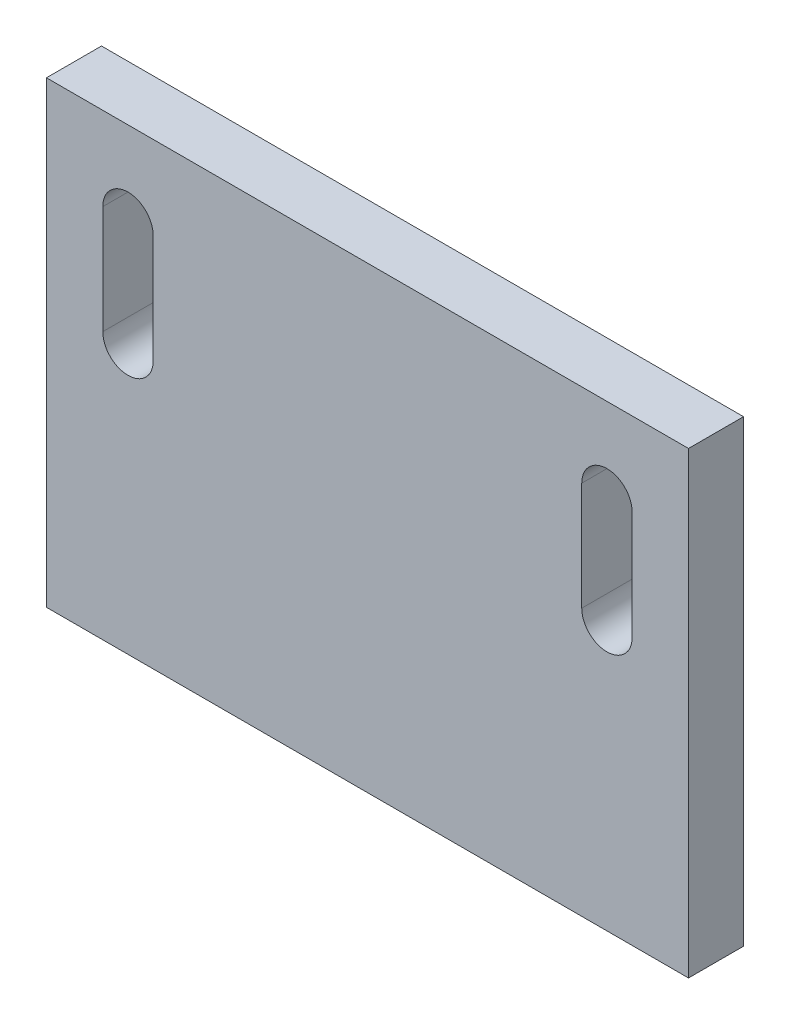
ISO-10303-21;
HEADER;
FILE_DESCRIPTION(('STEP AP214'),'2;1');
FILE_NAME('part.step','',(''),(''),'','','');
FILE_SCHEMA(('AUTOMOTIVE_DESIGN { 1 0 10303 214 1 1 1 1 }'));
ENDSEC;
DATA;
#1=APPLICATION_CONTEXT('core data for automotive mechanical design processes');
#2=APPLICATION_PROTOCOL_DEFINITION('international standard','automotive_design',2000,#1);
#3=PRODUCT_CONTEXT('',#1,'mechanical');
#4=PRODUCT('Part','Part','',(#3));
#5=PRODUCT_RELATED_PRODUCT_CATEGORY('part','',(#4));
#6=PRODUCT_DEFINITION_FORMATION('','',#4);
#7=PRODUCT_DEFINITION_CONTEXT('part definition',#1,'design');
#8=PRODUCT_DEFINITION('design','',#6,#7);
#9=PRODUCT_DEFINITION_SHAPE('','',#8);
#10=(LENGTH_UNIT() NAMED_UNIT(*) SI_UNIT(.MILLI.,.METRE.));
#11=(NAMED_UNIT(*) PLANE_ANGLE_UNIT() SI_UNIT($,.RADIAN.));
#12=(NAMED_UNIT(*) SI_UNIT($,.STERADIAN.) SOLID_ANGLE_UNIT());
#13=UNCERTAINTY_MEASURE_WITH_UNIT(LENGTH_MEASURE(1.E-05),#10,'distance_accuracy_value','');
#14=(GEOMETRIC_REPRESENTATION_CONTEXT(3) GLOBAL_UNCERTAINTY_ASSIGNED_CONTEXT((#13)) GLOBAL_UNIT_ASSIGNED_CONTEXT((#10,
#11,#12)) REPRESENTATION_CONTEXT('',''));
#15=CARTESIAN_POINT('',(0.,0.,0.));
#16=DIRECTION('',(0.,0.,1.));
#17=DIRECTION('',(1.,0.,0.));
#18=AXIS2_PLACEMENT_3D('',#15,#16,#17);
#19=CARTESIAN_POINT('',(0.,0.,6.));
#20=DIRECTION('',(0.,0.,-1.));
#21=DIRECTION('',(-1.,0.,0.));
#22=AXIS2_PLACEMENT_3D('',#19,#20,#21);
#23=PLANE('',#22);
#24=CARTESIAN_POINT('',(-26.11,4.09724355203366,6.));
#25=DIRECTION('',(0.,0.,1.));
#26=DIRECTION('',(-1.,0.,0.));
#27=AXIS2_PLACEMENT_3D('',#24,#25,#26);
#28=CIRCLE('',#27,2.75);
#29=CARTESIAN_POINT('',(-28.86,4.09724355203366,6.));
#30=VERTEX_POINT('',#29);
#31=CARTESIAN_POINT('',(-23.36,4.09724355203366,6.));
#32=VERTEX_POINT('',#31);
#33=EDGE_CURVE('E163',#30,#32,#28,.T.);
#34=ORIENTED_EDGE('',*,*,#33,.F.);
#35=DIRECTION('',(0.,-1.,0.));
#36=VECTOR('',#35,1.);
#37=CARTESIAN_POINT('',(-28.86,4.09724355203366,6.));
#38=LINE('',#37,#36);
#39=CARTESIAN_POINT('',(-28.86,15.9027564479663,6.));
#40=VERTEX_POINT('',#39);
#41=EDGE_CURVE('E170',#40,#30,#38,.T.);
#42=ORIENTED_EDGE('',*,*,#41,.F.);
#43=CARTESIAN_POINT('',(-26.11,15.9027564479663,6.));
#44=DIRECTION('',(0.,0.,1.));
#45=DIRECTION('',(-1.,0.,0.));
#46=AXIS2_PLACEMENT_3D('',#43,#44,#45);
#47=CIRCLE('',#46,2.75);
#48=CARTESIAN_POINT('',(-23.36,15.9027564479663,6.));
#49=VERTEX_POINT('',#48);
#50=EDGE_CURVE('E168',#49,#40,#47,.T.);
#51=ORIENTED_EDGE('',*,*,#50,.F.);
#52=DIRECTION('',(0.,1.,0.));
#53=VECTOR('',#52,1.);
#54=CARTESIAN_POINT('',(-23.36,4.09724355203366,6.));
#55=LINE('',#54,#53);
#56=EDGE_CURVE('E165',#32,#49,#55,.T.);
#57=ORIENTED_EDGE('',*,*,#56,.F.);
#58=EDGE_LOOP('',(#34,#42,#51,#57));
#59=FACE_BOUND('',#58,.T.);
#60=DIRECTION('',(0.,1.,0.));
#61=VECTOR('',#60,1.);
#62=CARTESIAN_POINT('',(35.,-25.,6.));
#63=LINE('',#62,#61);
#64=CARTESIAN_POINT('',(35.,-25.,6.));
#65=VERTEX_POINT('',#64);
#66=CARTESIAN_POINT('',(35.,25.,6.));
#67=VERTEX_POINT('',#66);
#68=EDGE_CURVE('E191',#65,#67,#63,.T.);
#69=ORIENTED_EDGE('',*,*,#68,.T.);
#70=DIRECTION('',(-1.,0.,0.));
#71=VECTOR('',#70,1.);
#72=CARTESIAN_POINT('',(-35.,25.,6.));
#73=LINE('',#72,#71);
#74=CARTESIAN_POINT('',(-35.,25.,6.));
#75=VERTEX_POINT('',#74);
#76=EDGE_CURVE('E194',#67,#75,#73,.T.);
#77=ORIENTED_EDGE('',*,*,#76,.T.);
#78=DIRECTION('',(0.,-1.,0.));
#79=VECTOR('',#78,1.);
#80=CARTESIAN_POINT('',(-35.,-25.,6.));
#81=LINE('',#80,#79);
#82=CARTESIAN_POINT('',(-35.,-25.,6.));
#83=VERTEX_POINT('',#82);
#84=EDGE_CURVE('E197',#75,#83,#81,.T.);
#85=ORIENTED_EDGE('',*,*,#84,.T.);
#86=DIRECTION('',(1.,0.,0.));
#87=VECTOR('',#86,1.);
#88=CARTESIAN_POINT('',(-35.,-25.,6.));
#89=LINE('',#88,#87);
#90=EDGE_CURVE('E199',#83,#65,#89,.T.);
#91=ORIENTED_EDGE('',*,*,#90,.T.);
#92=EDGE_LOOP('',(#69,#77,#85,#91));
#93=FACE_BOUND('',#92,.T.);
#94=CARTESIAN_POINT('',(26.11,4.09724355203366,6.));
#95=DIRECTION('',(0.,0.,1.));
#96=DIRECTION('',(1.,0.,0.));
#97=AXIS2_PLACEMENT_3D('',#94,#95,#96);
#98=CIRCLE('',#97,2.75);
#99=CARTESIAN_POINT('',(23.36,4.09724355203366,6.));
#100=VERTEX_POINT('',#99);
#101=CARTESIAN_POINT('',(28.86,4.09724355203366,6.));
#102=VERTEX_POINT('',#101);
#103=EDGE_CURVE('E123',#100,#102,#98,.T.);
#104=ORIENTED_EDGE('',*,*,#103,.F.);
#105=DIRECTION('',(0.,-1.,0.));
#106=VECTOR('',#105,1.);
#107=CARTESIAN_POINT('',(23.36,4.09724355203366,6.));
#108=LINE('',#107,#106);
#109=CARTESIAN_POINT('',(23.36,15.9027564479663,6.));
#110=VERTEX_POINT('',#109);
#111=EDGE_CURVE('E147',#110,#100,#108,.T.);
#112=ORIENTED_EDGE('',*,*,#111,.F.);
#113=CARTESIAN_POINT('',(26.11,15.9027564479663,6.));
#114=DIRECTION('',(0.,0.,1.));
#115=DIRECTION('',(1.,0.,0.));
#116=AXIS2_PLACEMENT_3D('',#113,#114,#115);
#117=CIRCLE('',#116,2.75);
#118=CARTESIAN_POINT('',(28.86,15.9027564479663,6.));
#119=VERTEX_POINT('',#118);
#120=EDGE_CURVE('E145',#119,#110,#117,.T.);
#121=ORIENTED_EDGE('',*,*,#120,.F.);
#122=DIRECTION('',(0.,1.,0.));
#123=VECTOR('',#122,1.);
#124=CARTESIAN_POINT('',(28.86,4.09724355203366,6.));
#125=LINE('',#124,#123);
#126=EDGE_CURVE('E133',#102,#119,#125,.T.);
#127=ORIENTED_EDGE('',*,*,#126,.F.);
#128=EDGE_LOOP('',(#104,#112,#121,#127));
#129=FACE_BOUND('',#128,.T.);
#130=ADVANCED_FACE('F33',(#59,#93,#129),#23,.F.);
#131=CARTESIAN_POINT('',(0.,0.,0.));
#132=DIRECTION('',(0.,0.,-1.));
#133=DIRECTION('',(-1.,0.,0.));
#134=AXIS2_PLACEMENT_3D('',#131,#132,#133);
#135=PLANE('',#134);
#136=DIRECTION('',(0.,1.,0.));
#137=VECTOR('',#136,1.);
#138=CARTESIAN_POINT('',(35.,-25.,0.));
#139=LINE('',#138,#137);
#140=CARTESIAN_POINT('',(35.,-25.,0.));
#141=VERTEX_POINT('',#140);
#142=CARTESIAN_POINT('',(35.,25.,0.));
#143=VERTEX_POINT('',#142);
#144=EDGE_CURVE('E141',#141,#143,#139,.T.);
#145=ORIENTED_EDGE('',*,*,#144,.F.);
#146=DIRECTION('',(1.,0.,0.));
#147=VECTOR('',#146,1.);
#148=CARTESIAN_POINT('',(-35.,-25.,0.));
#149=LINE('',#148,#147);
#150=CARTESIAN_POINT('',(-35.,-25.,0.));
#151=VERTEX_POINT('',#150);
#152=EDGE_CURVE('E195',#151,#141,#149,.T.);
#153=ORIENTED_EDGE('',*,*,#152,.F.);
#154=DIRECTION('',(0.,-1.,0.));
#155=VECTOR('',#154,1.);
#156=CARTESIAN_POINT('',(-35.,-25.,0.));
#157=LINE('',#156,#155);
#158=CARTESIAN_POINT('',(-35.,25.,0.));
#159=VERTEX_POINT('',#158);
#160=EDGE_CURVE('E206',#159,#151,#157,.T.);
#161=ORIENTED_EDGE('',*,*,#160,.F.);
#162=DIRECTION('',(-1.,0.,0.));
#163=VECTOR('',#162,1.);
#164=CARTESIAN_POINT('',(-35.,25.,0.));
#165=LINE('',#164,#163);
#166=EDGE_CURVE('E204',#143,#159,#165,.T.);
#167=ORIENTED_EDGE('',*,*,#166,.F.);
#168=EDGE_LOOP('',(#145,#153,#161,#167));
#169=FACE_BOUND('',#168,.T.);
#170=DIRECTION('',(0.,-1.,0.));
#171=VECTOR('',#170,1.);
#172=CARTESIAN_POINT('',(-28.86,4.09724355203366,0.));
#173=LINE('',#172,#171);
#174=CARTESIAN_POINT('',(-28.86,15.9027564479663,0.));
#175=VERTEX_POINT('',#174);
#176=CARTESIAN_POINT('',(-28.86,4.09724355203366,0.));
#177=VERTEX_POINT('',#176);
#178=EDGE_CURVE('E166',#175,#177,#173,.T.);
#179=ORIENTED_EDGE('',*,*,#178,.T.);
#180=CARTESIAN_POINT('',(-26.11,4.09724355203366,0.));
#181=DIRECTION('',(0.,0.,1.));
#182=DIRECTION('',(-1.,0.,0.));
#183=AXIS2_PLACEMENT_3D('',#180,#181,#182);
#184=CIRCLE('',#183,2.75);
#185=CARTESIAN_POINT('',(-23.36,4.09724355203366,0.));
#186=VERTEX_POINT('',#185);
#187=EDGE_CURVE('E173',#177,#186,#184,.T.);
#188=ORIENTED_EDGE('',*,*,#187,.T.);
#189=DIRECTION('',(0.,1.,0.));
#190=VECTOR('',#189,1.);
#191=CARTESIAN_POINT('',(-23.36,4.09724355203366,0.));
#192=LINE('',#191,#190);
#193=CARTESIAN_POINT('',(-23.36,15.9027564479663,0.));
#194=VERTEX_POINT('',#193);
#195=EDGE_CURVE('E176',#186,#194,#192,.T.);
#196=ORIENTED_EDGE('',*,*,#195,.T.);
#197=CARTESIAN_POINT('',(-26.11,15.9027564479663,0.));
#198=DIRECTION('',(0.,0.,1.));
#199=DIRECTION('',(-1.,0.,0.));
#200=AXIS2_PLACEMENT_3D('',#197,#198,#199);
#201=CIRCLE('',#200,2.75);
#202=EDGE_CURVE('E179',#194,#175,#201,.T.);
#203=ORIENTED_EDGE('',*,*,#202,.T.);
#204=EDGE_LOOP('',(#179,#188,#196,#203));
#205=FACE_BOUND('',#204,.T.);
#206=DIRECTION('',(0.,-1.,0.));
#207=VECTOR('',#206,1.);
#208=CARTESIAN_POINT('',(23.36,4.09724355203366,0.));
#209=LINE('',#208,#207);
#210=CARTESIAN_POINT('',(23.36,15.9027564479663,0.));
#211=VERTEX_POINT('',#210);
#212=CARTESIAN_POINT('',(23.36,4.09724355203366,0.));
#213=VERTEX_POINT('',#212);
#214=EDGE_CURVE('E134',#211,#213,#209,.T.);
#215=ORIENTED_EDGE('',*,*,#214,.T.);
#216=CARTESIAN_POINT('',(26.11,4.09724355203366,0.));
#217=DIRECTION('',(0.,0.,1.));
#218=DIRECTION('',(1.,0.,0.));
#219=AXIS2_PLACEMENT_3D('',#216,#217,#218);
#220=CIRCLE('',#219,2.75);
#221=CARTESIAN_POINT('',(28.86,4.09724355203366,0.));
#222=VERTEX_POINT('',#221);
#223=EDGE_CURVE('E151',#213,#222,#220,.T.);
#224=ORIENTED_EDGE('',*,*,#223,.T.);
#225=DIRECTION('',(0.,1.,0.));
#226=VECTOR('',#225,1.);
#227=CARTESIAN_POINT('',(28.86,4.09724355203366,0.));
#228=LINE('',#227,#226);
#229=CARTESIAN_POINT('',(28.86,15.9027564479663,0.));
#230=VERTEX_POINT('',#229);
#231=EDGE_CURVE('E140',#222,#230,#228,.T.);
#232=ORIENTED_EDGE('',*,*,#231,.T.);
#233=CARTESIAN_POINT('',(26.11,15.9027564479663,0.));
#234=DIRECTION('',(0.,0.,1.));
#235=DIRECTION('',(1.,0.,0.));
#236=AXIS2_PLACEMENT_3D('',#233,#234,#235);
#237=CIRCLE('',#236,2.75);
#238=EDGE_CURVE('E155',#230,#211,#237,.T.);
#239=ORIENTED_EDGE('',*,*,#238,.T.);
#240=EDGE_LOOP('',(#215,#224,#232,#239));
#241=FACE_BOUND('',#240,.T.);
#242=ADVANCED_FACE('F224',(#169,#205,#241),#135,.T.);
#243=CARTESIAN_POINT('',(35.,-25.,6.));
#244=DIRECTION('',(-1.,0.,0.));
#245=DIRECTION('',(0.,0.,1.));
#246=AXIS2_PLACEMENT_3D('',#243,#244,#245);
#247=PLANE('',#246);
#248=ORIENTED_EDGE('',*,*,#144,.T.);
#249=DIRECTION('',(0.,0.,-1.));
#250=VECTOR('',#249,1.);
#251=CARTESIAN_POINT('',(35.,25.,6.));
#252=LINE('',#251,#250);
#253=EDGE_CURVE('E11',#67,#143,#252,.T.);
#254=ORIENTED_EDGE('',*,*,#253,.F.);
#255=ORIENTED_EDGE('',*,*,#68,.F.);
#256=DIRECTION('',(0.,0.,-1.));
#257=VECTOR('',#256,1.);
#258=CARTESIAN_POINT('',(35.,-25.,6.));
#259=LINE('',#258,#257);
#260=EDGE_CURVE('E201',#65,#141,#259,.T.);
#261=ORIENTED_EDGE('',*,*,#260,.T.);
#262=EDGE_LOOP('',(#248,#254,#255,#261));
#263=FACE_BOUND('',#262,.T.);
#264=ADVANCED_FACE('F35',(#263),#247,.F.);
#265=CARTESIAN_POINT('',(-35.,25.,6.));
#266=DIRECTION('',(0.,-1.,0.));
#267=DIRECTION('',(0.,0.,-1.));
#268=AXIS2_PLACEMENT_3D('',#265,#266,#267);
#269=PLANE('',#268);
#270=ORIENTED_EDGE('',*,*,#166,.T.);
#271=DIRECTION('',(0.,0.,-1.));
#272=VECTOR('',#271,1.);
#273=CARTESIAN_POINT('',(-35.,25.,6.));
#274=LINE('',#273,#272);
#275=EDGE_CURVE('E41',#75,#159,#274,.T.);
#276=ORIENTED_EDGE('',*,*,#275,.F.);
#277=ORIENTED_EDGE('',*,*,#76,.F.);
#278=ORIENTED_EDGE('',*,*,#253,.T.);
#279=EDGE_LOOP('',(#270,#276,#277,#278));
#280=FACE_BOUND('',#279,.T.);
#281=ADVANCED_FACE('F234',(#280),#269,.F.);
#282=CARTESIAN_POINT('',(-35.,-25.,6.));
#283=DIRECTION('',(1.,0.,0.));
#284=DIRECTION('',(0.,0.,-1.));
#285=AXIS2_PLACEMENT_3D('',#282,#283,#284);
#286=PLANE('',#285);
#287=ORIENTED_EDGE('',*,*,#160,.T.);
#288=DIRECTION('',(0.,0.,-1.));
#289=VECTOR('',#288,1.);
#290=CARTESIAN_POINT('',(-35.,-25.,6.));
#291=LINE('',#290,#289);
#292=EDGE_CURVE('E211',#83,#151,#291,.T.);
#293=ORIENTED_EDGE('',*,*,#292,.F.);
#294=ORIENTED_EDGE('',*,*,#84,.F.);
#295=ORIENTED_EDGE('',*,*,#275,.T.);
#296=EDGE_LOOP('',(#287,#293,#294,#295));
#297=FACE_BOUND('',#296,.T.);
#298=ADVANCED_FACE('F218',(#297),#286,.F.);
#299=CARTESIAN_POINT('',(-35.,-25.,6.));
#300=DIRECTION('',(0.,1.,0.));
#301=DIRECTION('',(0.,0.,1.));
#302=AXIS2_PLACEMENT_3D('',#299,#300,#301);
#303=PLANE('',#302);
#304=ORIENTED_EDGE('',*,*,#152,.T.);
#305=ORIENTED_EDGE('',*,*,#260,.F.);
#306=ORIENTED_EDGE('',*,*,#90,.F.);
#307=ORIENTED_EDGE('',*,*,#292,.T.);
#308=EDGE_LOOP('',(#304,#305,#306,#307));
#309=FACE_BOUND('',#308,.T.);
#310=ADVANCED_FACE('F228',(#309),#303,.F.);
#311=CARTESIAN_POINT('',(-26.11,4.09724355203366,6.));
#312=DIRECTION('',(0.,0.,-1.));
#313=DIRECTION('',(-1.,0.,0.));
#314=AXIS2_PLACEMENT_3D('',#311,#312,#313);
#315=CYLINDRICAL_SURFACE('',#314,2.75);
#316=ORIENTED_EDGE('',*,*,#187,.F.);
#317=DIRECTION('',(0.,0.,-1.));
#318=VECTOR('',#317,1.);
#319=CARTESIAN_POINT('',(-28.86,4.09724355203366,6.));
#320=LINE('',#319,#318);
#321=EDGE_CURVE('E172',#30,#177,#320,.T.);
#322=ORIENTED_EDGE('',*,*,#321,.F.);
#323=ORIENTED_EDGE('',*,*,#33,.T.);
#324=DIRECTION('',(0.,0.,-1.));
#325=VECTOR('',#324,1.);
#326=CARTESIAN_POINT('',(-23.36,4.09724355203366,6.));
#327=LINE('',#326,#325);
#328=EDGE_CURVE('E153',#32,#186,#327,.T.);
#329=ORIENTED_EDGE('',*,*,#328,.T.);
#330=EDGE_LOOP('',(#316,#322,#323,#329));
#331=FACE_BOUND('',#330,.T.);
#332=ADVANCED_FACE('F250',(#331),#315,.F.);
#333=CARTESIAN_POINT('',(-23.36,4.09724355203366,6.));
#334=DIRECTION('',(-1.,0.,0.));
#335=DIRECTION('',(0.,-1.,0.));
#336=AXIS2_PLACEMENT_3D('',#333,#334,#335);
#337=PLANE('',#336);
#338=ORIENTED_EDGE('',*,*,#195,.F.);
#339=ORIENTED_EDGE('',*,*,#328,.F.);
#340=ORIENTED_EDGE('',*,*,#56,.T.);
#341=DIRECTION('',(0.,0.,-1.));
#342=VECTOR('',#341,1.);
#343=CARTESIAN_POINT('',(-23.36,15.9027564479663,6.));
#344=LINE('',#343,#342);
#345=EDGE_CURVE('E187',#49,#194,#344,.T.);
#346=ORIENTED_EDGE('',*,*,#345,.T.);
#347=EDGE_LOOP('',(#338,#339,#340,#346));
#348=FACE_BOUND('',#347,.T.);
#349=ADVANCED_FACE('F257',(#348),#337,.T.);
#350=CARTESIAN_POINT('',(-26.11,15.9027564479663,6.));
#351=DIRECTION('',(0.,0.,-1.));
#352=DIRECTION('',(-1.,0.,0.));
#353=AXIS2_PLACEMENT_3D('',#350,#351,#352);
#354=CYLINDRICAL_SURFACE('',#353,2.75);
#355=ORIENTED_EDGE('',*,*,#202,.F.);
#356=ORIENTED_EDGE('',*,*,#345,.F.);
#357=ORIENTED_EDGE('',*,*,#50,.T.);
#358=DIRECTION('',(0.,0.,-1.));
#359=VECTOR('',#358,1.);
#360=CARTESIAN_POINT('',(-28.86,15.9027564479663,6.));
#361=LINE('',#360,#359);
#362=EDGE_CURVE('E56',#40,#175,#361,.T.);
#363=ORIENTED_EDGE('',*,*,#362,.T.);
#364=EDGE_LOOP('',(#355,#356,#357,#363));
#365=FACE_BOUND('',#364,.T.);
#366=ADVANCED_FACE('F262',(#365),#354,.F.);
#367=CARTESIAN_POINT('',(-28.86,4.09724355203366,6.));
#368=DIRECTION('',(1.,0.,0.));
#369=DIRECTION('',(0.,1.,0.));
#370=AXIS2_PLACEMENT_3D('',#367,#368,#369);
#371=PLANE('',#370);
#372=ORIENTED_EDGE('',*,*,#178,.F.);
#373=ORIENTED_EDGE('',*,*,#362,.F.);
#374=ORIENTED_EDGE('',*,*,#41,.T.);
#375=ORIENTED_EDGE('',*,*,#321,.T.);
#376=EDGE_LOOP('',(#372,#373,#374,#375));
#377=FACE_BOUND('',#376,.T.);
#378=ADVANCED_FACE('F266',(#377),#371,.T.);
#379=CARTESIAN_POINT('',(26.11,4.09724355203366,6.));
#380=DIRECTION('',(0.,0.,-1.));
#381=DIRECTION('',(-1.,0.,0.));
#382=AXIS2_PLACEMENT_3D('',#379,#380,#381);
#383=CYLINDRICAL_SURFACE('',#382,2.75);
#384=ORIENTED_EDGE('',*,*,#223,.F.);
#385=DIRECTION('',(0.,0.,-1.));
#386=VECTOR('',#385,1.);
#387=CARTESIAN_POINT('',(23.36,4.09724355203366,6.));
#388=LINE('',#387,#386);
#389=EDGE_CURVE('E129',#100,#213,#388,.T.);
#390=ORIENTED_EDGE('',*,*,#389,.F.);
#391=ORIENTED_EDGE('',*,*,#103,.T.);
#392=DIRECTION('',(0.,0.,-1.));
#393=VECTOR('',#392,1.);
#394=CARTESIAN_POINT('',(28.86,4.09724355203366,6.));
#395=LINE('',#394,#393);
#396=EDGE_CURVE('E126',#102,#222,#395,.T.);
#397=ORIENTED_EDGE('',*,*,#396,.T.);
#398=EDGE_LOOP('',(#384,#390,#391,#397));
#399=FACE_BOUND('',#398,.T.);
#400=ADVANCED_FACE('F125',(#399),#383,.F.);
#401=CARTESIAN_POINT('',(28.86,4.09724355203366,6.));
#402=DIRECTION('',(-1.,0.,0.));
#403=DIRECTION('',(0.,-1.,0.));
#404=AXIS2_PLACEMENT_3D('',#401,#402,#403);
#405=PLANE('',#404);
#406=ORIENTED_EDGE('',*,*,#231,.F.);
#407=ORIENTED_EDGE('',*,*,#396,.F.);
#408=ORIENTED_EDGE('',*,*,#126,.T.);
#409=DIRECTION('',(0.,0.,-1.));
#410=VECTOR('',#409,1.);
#411=CARTESIAN_POINT('',(28.86,15.9027564479663,6.));
#412=LINE('',#411,#410);
#413=EDGE_CURVE('E142',#119,#230,#412,.T.);
#414=ORIENTED_EDGE('',*,*,#413,.T.);
#415=EDGE_LOOP('',(#406,#407,#408,#414));
#416=FACE_BOUND('',#415,.T.);
#417=ADVANCED_FACE('F137',(#416),#405,.T.);
#418=CARTESIAN_POINT('',(26.11,15.9027564479663,6.));
#419=DIRECTION('',(0.,0.,-1.));
#420=DIRECTION('',(-1.,0.,0.));
#421=AXIS2_PLACEMENT_3D('',#418,#419,#420);
#422=CYLINDRICAL_SURFACE('',#421,2.75);
#423=ORIENTED_EDGE('',*,*,#238,.F.);
#424=ORIENTED_EDGE('',*,*,#413,.F.);
#425=ORIENTED_EDGE('',*,*,#120,.T.);
#426=DIRECTION('',(0.,0.,-1.));
#427=VECTOR('',#426,1.);
#428=CARTESIAN_POINT('',(23.36,15.9027564479663,6.));
#429=LINE('',#428,#427);
#430=EDGE_CURVE('E48',#110,#211,#429,.T.);
#431=ORIENTED_EDGE('',*,*,#430,.T.);
#432=EDGE_LOOP('',(#423,#424,#425,#431));
#433=FACE_BOUND('',#432,.T.);
#434=ADVANCED_FACE('F285',(#433),#422,.F.);
#435=CARTESIAN_POINT('',(23.36,4.09724355203366,6.));
#436=DIRECTION('',(1.,0.,0.));
#437=DIRECTION('',(0.,1.,0.));
#438=AXIS2_PLACEMENT_3D('',#435,#436,#437);
#439=PLANE('',#438);
#440=ORIENTED_EDGE('',*,*,#214,.F.);
#441=ORIENTED_EDGE('',*,*,#430,.F.);
#442=ORIENTED_EDGE('',*,*,#111,.T.);
#443=ORIENTED_EDGE('',*,*,#389,.T.);
#444=EDGE_LOOP('',(#440,#441,#442,#443));
#445=FACE_BOUND('',#444,.T.);
#446=ADVANCED_FACE('F288',(#445),#439,.T.);
#447=CLOSED_SHELL('',(#130,#242,#264,#281,#298,#310,#332,#349,#366,#378,#400,#417,#434,#446));
#448=MANIFOLD_SOLID_BREP('B2',#447);
#449=ADVANCED_BREP_SHAPE_REPRESENTATION('',(#18,#448),#14);
#450=SHAPE_DEFINITION_REPRESENTATION(#9,#449);
ENDSEC;
END-ISO-10303-21;
